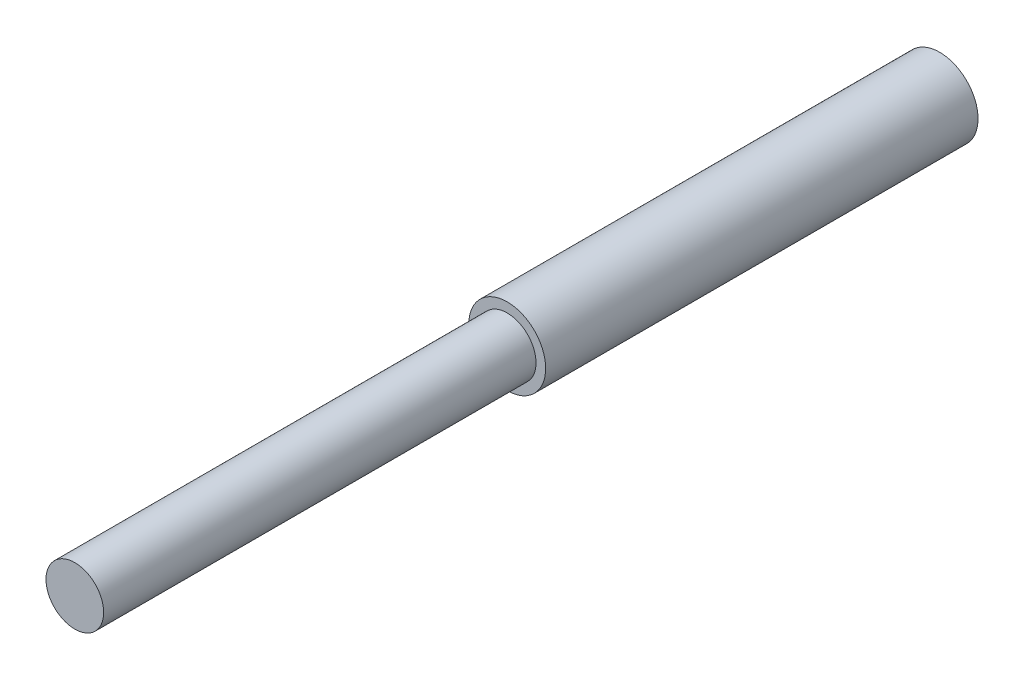
ISO-10303-21;
HEADER;
FILE_DESCRIPTION(('STEP AP214'),'2;1');
FILE_NAME('part.step','',(''),(''),'','','');
FILE_SCHEMA(('AUTOMOTIVE_DESIGN { 1 0 10303 214 1 1 1 1 }'));
ENDSEC;
DATA;
#1=APPLICATION_CONTEXT('core data for automotive mechanical design processes');
#2=APPLICATION_PROTOCOL_DEFINITION('international standard','automotive_design',2000,#1);
#3=PRODUCT_CONTEXT('',#1,'mechanical');
#4=PRODUCT('Part','Part','',(#3));
#5=PRODUCT_RELATED_PRODUCT_CATEGORY('part','',(#4));
#6=PRODUCT_DEFINITION_FORMATION('','',#4);
#7=PRODUCT_DEFINITION_CONTEXT('part definition',#1,'design');
#8=PRODUCT_DEFINITION('design','',#6,#7);
#9=PRODUCT_DEFINITION_SHAPE('','',#8);
#10=(LENGTH_UNIT() NAMED_UNIT(*) SI_UNIT(.MILLI.,.METRE.));
#11=(NAMED_UNIT(*) PLANE_ANGLE_UNIT() SI_UNIT($,.RADIAN.));
#12=(NAMED_UNIT(*) SI_UNIT($,.STERADIAN.) SOLID_ANGLE_UNIT());
#13=UNCERTAINTY_MEASURE_WITH_UNIT(LENGTH_MEASURE(1.E-05),#10,'distance_accuracy_value','');
#14=(GEOMETRIC_REPRESENTATION_CONTEXT(3) GLOBAL_UNCERTAINTY_ASSIGNED_CONTEXT((#13)) GLOBAL_UNIT_ASSIGNED_CONTEXT((#10,
#11,#12)) REPRESENTATION_CONTEXT('',''));
#15=CARTESIAN_POINT('',(0.,0.,0.));
#16=DIRECTION('',(0.,0.,1.));
#17=DIRECTION('',(1.,0.,0.));
#18=AXIS2_PLACEMENT_3D('',#15,#16,#17);
#19=CARTESIAN_POINT('',(0.,0.,45.));
#20=DIRECTION('',(0.,0.,-1.));
#21=DIRECTION('',(-1.,0.,0.));
#22=AXIS2_PLACEMENT_3D('',#19,#20,#21);
#23=CYLINDRICAL_SURFACE('',#22,4.);
#24=CARTESIAN_POINT('',(0.,0.,45.));
#25=DIRECTION('',(0.,0.,1.));
#26=DIRECTION('',(1.,0.,0.));
#27=AXIS2_PLACEMENT_3D('',#24,#25,#26);
#28=CIRCLE('',#27,4.);
#29=CARTESIAN_POINT('',(-4.,0.,45.));
#30=VERTEX_POINT('',#29);
#31=EDGE_CURVE('E45',#30,#30,#28,.T.);
#32=CARTESIAN_POINT('',(0.,0.,0.));
#33=DIRECTION('',(0.,0.,1.));
#34=DIRECTION('',(1.,0.,0.));
#35=AXIS2_PLACEMENT_3D('',#32,#33,#34);
#36=CIRCLE('',#35,4.);
#37=CARTESIAN_POINT('',(-4.,0.,0.));
#38=VERTEX_POINT('',#37);
#39=EDGE_CURVE('E40',#38,#38,#36,.T.);
#40=CARTESIAN_POINT('',(-4.,0.,45.));
#41=CARTESIAN_POINT('',(-4.,0.,44.53125));
#42=CARTESIAN_POINT('',(-4.,0.,44.0625));
#43=CARTESIAN_POINT('',(-4.,0.,43.125));
#44=CARTESIAN_POINT('',(-4.,0.,42.65625));
#45=CARTESIAN_POINT('',(-4.,0.,41.71875));
#46=CARTESIAN_POINT('',(-4.,0.,41.25));
#47=CARTESIAN_POINT('',(-4.,0.,40.3125));
#48=CARTESIAN_POINT('',(-4.,0.,39.84375));
#49=CARTESIAN_POINT('',(-4.,0.,38.90625));
#50=CARTESIAN_POINT('',(-4.,0.,38.4375));
#51=CARTESIAN_POINT('',(-4.,0.,37.5));
#52=CARTESIAN_POINT('',(-4.,0.,37.03125));
#53=CARTESIAN_POINT('',(-4.,0.,36.09375));
#54=CARTESIAN_POINT('',(-4.,0.,35.625));
#55=CARTESIAN_POINT('',(-4.,0.,34.6875));
#56=CARTESIAN_POINT('',(-4.,0.,34.21875));
#57=CARTESIAN_POINT('',(-4.,0.,33.28125));
#58=CARTESIAN_POINT('',(-4.,0.,32.8125));
#59=CARTESIAN_POINT('',(-4.,0.,31.875));
#60=CARTESIAN_POINT('',(-4.,0.,31.40625));
#61=CARTESIAN_POINT('',(-4.,0.,30.46875));
#62=CARTESIAN_POINT('',(-4.,0.,30.));
#63=CARTESIAN_POINT('',(-4.,0.,29.0625));
#64=CARTESIAN_POINT('',(-4.,0.,28.59375));
#65=CARTESIAN_POINT('',(-4.,0.,27.65625));
#66=CARTESIAN_POINT('',(-4.,0.,27.1875));
#67=CARTESIAN_POINT('',(-4.,0.,26.25));
#68=CARTESIAN_POINT('',(-4.,0.,25.78125));
#69=CARTESIAN_POINT('',(-4.,0.,24.84375));
#70=CARTESIAN_POINT('',(-4.,0.,24.375));
#71=CARTESIAN_POINT('',(-4.,0.,23.4375));
#72=CARTESIAN_POINT('',(-4.,0.,22.96875));
#73=CARTESIAN_POINT('',(-4.,0.,22.03125));
#74=CARTESIAN_POINT('',(-4.,0.,21.5625));
#75=CARTESIAN_POINT('',(-4.,0.,20.625));
#76=CARTESIAN_POINT('',(-4.,0.,20.15625));
#77=CARTESIAN_POINT('',(-4.,0.,19.21875));
#78=CARTESIAN_POINT('',(-4.,0.,18.75));
#79=CARTESIAN_POINT('',(-4.,0.,17.8125));
#80=CARTESIAN_POINT('',(-4.,0.,17.34375));
#81=CARTESIAN_POINT('',(-4.,0.,16.40625));
#82=CARTESIAN_POINT('',(-4.,0.,15.9375));
#83=CARTESIAN_POINT('',(-4.,0.,15.));
#84=CARTESIAN_POINT('',(-4.,0.,14.53125));
#85=CARTESIAN_POINT('',(-4.,0.,13.59375));
#86=CARTESIAN_POINT('',(-4.,0.,13.125));
#87=CARTESIAN_POINT('',(-4.,0.,12.1875));
#88=CARTESIAN_POINT('',(-4.,0.,11.71875));
#89=CARTESIAN_POINT('',(-4.,0.,10.78125));
#90=CARTESIAN_POINT('',(-4.,0.,10.3125));
#91=CARTESIAN_POINT('',(-4.,0.,9.37499999999999));
#92=CARTESIAN_POINT('',(-4.,0.,8.90624999999999));
#93=CARTESIAN_POINT('',(-4.,0.,7.96874999999999));
#94=CARTESIAN_POINT('',(-4.,0.,7.5));
#95=CARTESIAN_POINT('',(-4.,0.,6.56249999999999));
#96=CARTESIAN_POINT('',(-4.,0.,6.09374999999999));
#97=CARTESIAN_POINT('',(-4.,0.,5.15624999999999));
#98=CARTESIAN_POINT('',(-4.,0.,4.68749999999999));
#99=CARTESIAN_POINT('',(-4.,0.,3.74999999999999));
#100=CARTESIAN_POINT('',(-4.,0.,3.28124999999999));
#101=CARTESIAN_POINT('',(-4.,0.,2.34374999999999));
#102=CARTESIAN_POINT('',(-4.,0.,1.87499999999999));
#103=CARTESIAN_POINT('',(-4.,0.,0.937499999999992));
#104=CARTESIAN_POINT('',(-4.,0.,0.468749999999993));
#105=CARTESIAN_POINT('',(-4.,0.,0.));
#106=B_SPLINE_CURVE_WITH_KNOTS('',3,(#40,#41,#42,#43,#44,#45,#46,#47,#48,#49,#50,#51,#52,#53,
#54,#55,#56,#57,#58,#59,#60,#61,#62,#63,#64,#65,#66,#67,#68,#69,#70,#71,#72,#73,#74,#75,#76,#77,
#78,#79,#80,#81,#82,#83,#84,#85,#86,#87,#88,#89,#90,#91,#92,#93,#94,#95,#96,#97,#98,#99,#100,
#101,#102,#103,#104,#105),.UNSPECIFIED.,.F.,.F.,(4,2,2,2,2,2,2,2,2,2,2,2,2,2,2,2,2,2,2,2,2,2,2,
2,2,2,2,2,2,2,2,2,4),(0.,1.40625,2.8125,4.21874999999999,5.625,7.03125,8.43749999999999,9.84375,
11.25,12.65625,14.0625,15.46875,16.875,18.28125,19.6875,21.09375,22.5,23.90625,25.3125,26.71875,
28.125,29.53125,30.9375,32.34375,33.75,35.15625,36.5625,37.96875,39.375,40.78125,42.1875,
43.59375,45.),.UNSPECIFIED.);
#107=EDGE_CURVE('BSEAM37',#30,#38,#106,.T.);
#108=ORIENTED_EDGE('',*,*,#31,.F.);
#109=ORIENTED_EDGE('',*,*,#39,.T.);
#110=ORIENTED_EDGE('',*,*,#107,.T.);
#111=ORIENTED_EDGE('',*,*,#107,.F.);
#112=EDGE_LOOP('',(#108,#110,#109,#111));
#113=FACE_BOUND('',#112,.T.);
#114=ADVANCED_FACE('F37',(#113),#23,.T.);
#115=CARTESIAN_POINT('',(0.,0.,45.));
#116=DIRECTION('',(0.,0.,1.));
#117=DIRECTION('',(1.,0.,0.));
#118=AXIS2_PLACEMENT_3D('',#115,#116,#117);
#119=PLANE('',#118);
#120=CARTESIAN_POINT('',(0.,0.,45.));
#121=DIRECTION('',(0.,0.,1.));
#122=DIRECTION('',(1.,0.,0.));
#123=AXIS2_PLACEMENT_3D('',#120,#121,#122);
#124=CIRCLE('',#123,3.);
#125=CARTESIAN_POINT('',(-3.,0.,45.));
#126=VERTEX_POINT('',#125);
#127=EDGE_CURVE('E10',#126,#126,#124,.T.);
#128=ORIENTED_EDGE('',*,*,#127,.F.);
#129=EDGE_LOOP('',(#128));
#130=FACE_BOUND('',#129,.T.);
#131=ORIENTED_EDGE('',*,*,#31,.T.);
#132=EDGE_LOOP('',(#131));
#133=FACE_BOUND('',#132,.T.);
#134=ADVANCED_FACE('F65',(#130,#133),#119,.T.);
#135=CARTESIAN_POINT('',(0.,0.,0.));
#136=DIRECTION('',(0.,0.,1.));
#137=DIRECTION('',(1.,0.,0.));
#138=AXIS2_PLACEMENT_3D('',#135,#136,#137);
#139=PLANE('',#138);
#140=ORIENTED_EDGE('',*,*,#39,.F.);
#141=EDGE_LOOP('',(#140));
#142=FACE_BOUND('',#141,.T.);
#143=ADVANCED_FACE('F62',(#142),#139,.F.);
#144=CARTESIAN_POINT('',(0.,0.,90.));
#145=DIRECTION('',(0.,0.,-1.));
#146=DIRECTION('',(-1.,0.,0.));
#147=AXIS2_PLACEMENT_3D('',#144,#145,#146);
#148=CYLINDRICAL_SURFACE('',#147,3.);
#149=CARTESIAN_POINT('',(0.,0.,90.));
#150=DIRECTION('',(0.,0.,1.));
#151=DIRECTION('',(1.,0.,0.));
#152=AXIS2_PLACEMENT_3D('',#149,#150,#151);
#153=CIRCLE('',#152,3.);
#154=CARTESIAN_POINT('',(-3.,0.,90.));
#155=VERTEX_POINT('',#154);
#156=EDGE_CURVE('E52',#155,#155,#153,.T.);
#157=CARTESIAN_POINT('',(-3.,0.,90.));
#158=CARTESIAN_POINT('',(-3.,0.,89.53125));
#159=CARTESIAN_POINT('',(-3.,0.,89.0625));
#160=CARTESIAN_POINT('',(-3.,0.,88.125));
#161=CARTESIAN_POINT('',(-3.,0.,87.65625));
#162=CARTESIAN_POINT('',(-3.,0.,86.71875));
#163=CARTESIAN_POINT('',(-3.,0.,86.25));
#164=CARTESIAN_POINT('',(-3.,0.,85.3125));
#165=CARTESIAN_POINT('',(-3.,0.,84.84375));
#166=CARTESIAN_POINT('',(-3.,0.,83.90625));
#167=CARTESIAN_POINT('',(-3.,0.,83.4375));
#168=CARTESIAN_POINT('',(-3.,0.,82.5));
#169=CARTESIAN_POINT('',(-3.,0.,82.03125));
#170=CARTESIAN_POINT('',(-3.,0.,81.09375));
#171=CARTESIAN_POINT('',(-3.,0.,80.625));
#172=CARTESIAN_POINT('',(-3.,0.,79.6875));
#173=CARTESIAN_POINT('',(-3.,0.,79.21875));
#174=CARTESIAN_POINT('',(-3.,0.,78.28125));
#175=CARTESIAN_POINT('',(-3.,0.,77.8125));
#176=CARTESIAN_POINT('',(-3.,0.,76.875));
#177=CARTESIAN_POINT('',(-3.,0.,76.40625));
#178=CARTESIAN_POINT('',(-3.,0.,75.46875));
#179=CARTESIAN_POINT('',(-3.,0.,75.));
#180=CARTESIAN_POINT('',(-3.,0.,74.0625));
#181=CARTESIAN_POINT('',(-3.,0.,73.59375));
#182=CARTESIAN_POINT('',(-3.,0.,72.65625));
#183=CARTESIAN_POINT('',(-3.,0.,72.1875));
#184=CARTESIAN_POINT('',(-3.,0.,71.25));
#185=CARTESIAN_POINT('',(-3.,0.,70.78125));
#186=CARTESIAN_POINT('',(-3.,0.,69.84375));
#187=CARTESIAN_POINT('',(-3.,0.,69.375));
#188=CARTESIAN_POINT('',(-3.,0.,68.4375));
#189=CARTESIAN_POINT('',(-3.,0.,67.96875));
#190=CARTESIAN_POINT('',(-3.,0.,67.03125));
#191=CARTESIAN_POINT('',(-3.,0.,66.5625));
#192=CARTESIAN_POINT('',(-3.,0.,65.625));
#193=CARTESIAN_POINT('',(-3.,0.,65.15625));
#194=CARTESIAN_POINT('',(-3.,0.,64.21875));
#195=CARTESIAN_POINT('',(-3.,0.,63.75));
#196=CARTESIAN_POINT('',(-3.,0.,62.8125));
#197=CARTESIAN_POINT('',(-3.,0.,62.34375));
#198=CARTESIAN_POINT('',(-3.,0.,61.40625));
#199=CARTESIAN_POINT('',(-3.,0.,60.9375));
#200=CARTESIAN_POINT('',(-3.,0.,60.));
#201=CARTESIAN_POINT('',(-3.,0.,59.53125));
#202=CARTESIAN_POINT('',(-3.,0.,58.59375));
#203=CARTESIAN_POINT('',(-3.,0.,58.125));
#204=CARTESIAN_POINT('',(-3.,0.,57.1875));
#205=CARTESIAN_POINT('',(-3.,0.,56.71875));
#206=CARTESIAN_POINT('',(-3.,0.,55.78125));
#207=CARTESIAN_POINT('',(-3.,0.,55.3125));
#208=CARTESIAN_POINT('',(-3.,0.,54.375));
#209=CARTESIAN_POINT('',(-3.,0.,53.90625));
#210=CARTESIAN_POINT('',(-3.,0.,52.96875));
#211=CARTESIAN_POINT('',(-3.,0.,52.5));
#212=CARTESIAN_POINT('',(-3.,0.,51.5625));
#213=CARTESIAN_POINT('',(-3.,0.,51.09375));
#214=CARTESIAN_POINT('',(-3.,0.,50.15625));
#215=CARTESIAN_POINT('',(-3.,0.,49.6875));
#216=CARTESIAN_POINT('',(-3.,0.,48.75));
#217=CARTESIAN_POINT('',(-3.,0.,48.28125));
#218=CARTESIAN_POINT('',(-3.,0.,47.34375));
#219=CARTESIAN_POINT('',(-3.,0.,46.875));
#220=CARTESIAN_POINT('',(-3.,0.,45.9375));
#221=CARTESIAN_POINT('',(-3.,0.,45.46875));
#222=CARTESIAN_POINT('',(-3.,0.,45.));
#223=B_SPLINE_CURVE_WITH_KNOTS('',3,(#157,#158,#159,#160,#161,#162,#163,#164,#165,#166,#167,
#168,#169,#170,#171,#172,#173,#174,#175,#176,#177,#178,#179,#180,#181,#182,#183,#184,#185,#186,
#187,#188,#189,#190,#191,#192,#193,#194,#195,#196,#197,#198,#199,#200,#201,#202,#203,#204,#205,
#206,#207,#208,#209,#210,#211,#212,#213,#214,#215,#216,#217,#218,#219,#220,#221,#222),
.UNSPECIFIED.,.F.,.F.,(4,2,2,2,2,2,2,2,2,2,2,2,2,2,2,2,2,2,2,2,2,2,2,2,2,2,2,2,2,2,2,2,4),(0.,
1.40625000000001,2.81250000000001,4.21875000000001,5.62500000000001,7.03125,8.4375,
9.84375000000001,11.25,12.65625,14.0625,15.46875,16.875,18.28125,19.6875,21.09375,22.5,23.90625,
25.3125,26.71875,28.125,29.53125,30.9375,32.34375,33.75,35.15625,36.5625,37.96875,39.375,
40.78125,42.1875,43.59375,45.),.UNSPECIFIED.);
#224=EDGE_CURVE('BSEAM64',#155,#126,#223,.T.);
#225=ORIENTED_EDGE('',*,*,#156,.F.);
#226=ORIENTED_EDGE('',*,*,#127,.T.);
#227=ORIENTED_EDGE('',*,*,#224,.T.);
#228=ORIENTED_EDGE('',*,*,#224,.F.);
#229=EDGE_LOOP('',(#225,#227,#226,#228));
#230=FACE_BOUND('',#229,.T.);
#231=ADVANCED_FACE('F64',(#230),#148,.T.);
#232=CARTESIAN_POINT('',(0.,0.,90.));
#233=DIRECTION('',(0.,0.,1.));
#234=DIRECTION('',(1.,0.,0.));
#235=AXIS2_PLACEMENT_3D('',#232,#233,#234);
#236=PLANE('',#235);
#237=ORIENTED_EDGE('',*,*,#156,.T.);
#238=EDGE_LOOP('',(#237));
#239=FACE_BOUND('',#238,.T.);
#240=ADVANCED_FACE('F70',(#239),#236,.T.);
#241=CLOSED_SHELL('',(#114,#134,#143,#231,#240));
#242=MANIFOLD_SOLID_BREP('B2',#241);
#243=ADVANCED_BREP_SHAPE_REPRESENTATION('',(#18,#242),#14);
#244=SHAPE_DEFINITION_REPRESENTATION(#9,#243);
ENDSEC;
END-ISO-10303-21;
